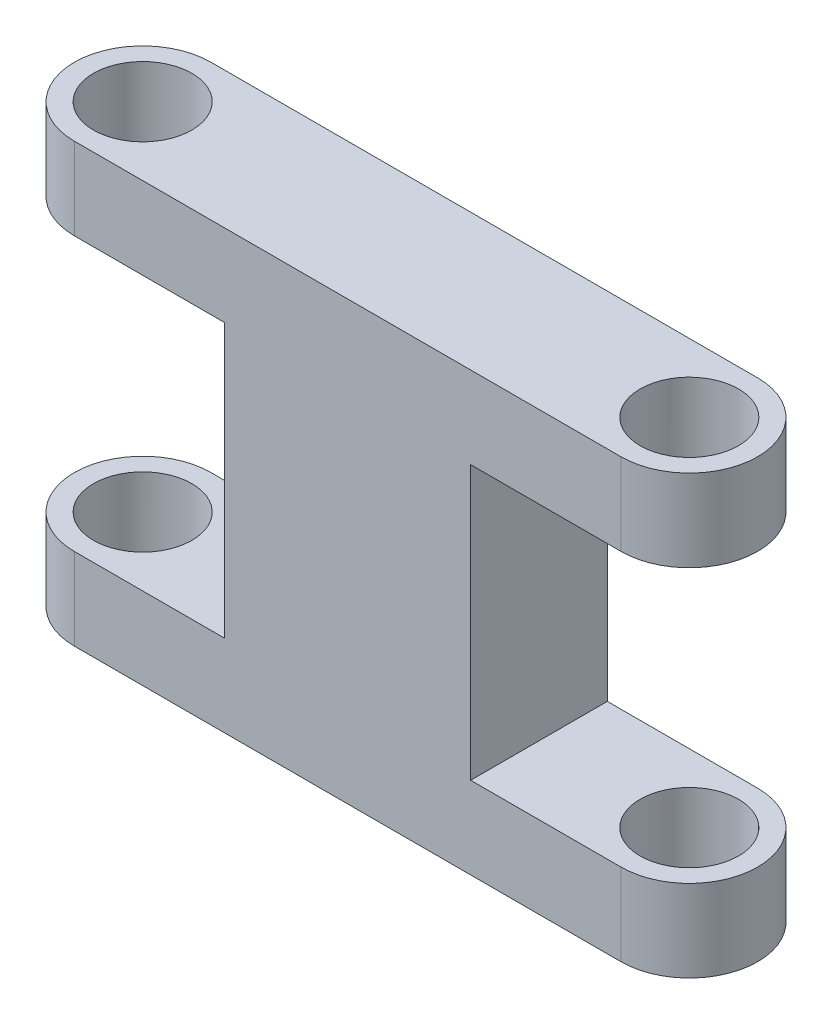
ISO-10303-21;
HEADER;
FILE_DESCRIPTION(('STEP AP214'),'2;1');
FILE_NAME('part.step','',(''),(''),'','','');
FILE_SCHEMA(('AUTOMOTIVE_DESIGN { 1 0 10303 214 1 1 1 1 }'));
ENDSEC;
DATA;
#1=APPLICATION_CONTEXT('core data for automotive mechanical design processes');
#2=APPLICATION_PROTOCOL_DEFINITION('international standard','automotive_design',2000,#1);
#3=PRODUCT_CONTEXT('',#1,'mechanical');
#4=PRODUCT('Part','Part','',(#3));
#5=PRODUCT_RELATED_PRODUCT_CATEGORY('part','',(#4));
#6=PRODUCT_DEFINITION_FORMATION('','',#4);
#7=PRODUCT_DEFINITION_CONTEXT('part definition',#1,'design');
#8=PRODUCT_DEFINITION('design','',#6,#7);
#9=PRODUCT_DEFINITION_SHAPE('','',#8);
#10=(LENGTH_UNIT() NAMED_UNIT(*) SI_UNIT(.MILLI.,.METRE.));
#11=(NAMED_UNIT(*) PLANE_ANGLE_UNIT() SI_UNIT($,.RADIAN.));
#12=(NAMED_UNIT(*) SI_UNIT($,.STERADIAN.) SOLID_ANGLE_UNIT());
#13=UNCERTAINTY_MEASURE_WITH_UNIT(LENGTH_MEASURE(1.E-05),#10,'distance_accuracy_value','');
#14=(GEOMETRIC_REPRESENTATION_CONTEXT(3) GLOBAL_UNCERTAINTY_ASSIGNED_CONTEXT((#13)) GLOBAL_UNIT_ASSIGNED_CONTEXT((#10,
#11,#12)) REPRESENTATION_CONTEXT('',''));
#15=CARTESIAN_POINT('',(0.,0.,0.));
#16=DIRECTION('',(0.,0.,1.));
#17=DIRECTION('',(1.,0.,0.));
#18=AXIS2_PLACEMENT_3D('',#15,#16,#17);
#19=CARTESIAN_POINT('',(24.,16.,4.));
#20=DIRECTION('',(0.,-1.,0.));
#21=DIRECTION('',(0.,0.,-1.));
#22=AXIS2_PLACEMENT_3D('',#19,#20,#21);
#23=CYLINDRICAL_SURFACE('',#22,2.5);
#24=CARTESIAN_POINT('',(24.,13.,4.));
#25=DIRECTION('',(0.,1.,0.));
#26=DIRECTION('',(-1.,0.,0.));
#27=AXIS2_PLACEMENT_3D('',#24,#25,#26);
#28=CIRCLE('',#27,2.5);
#29=CARTESIAN_POINT('',(24.,13.,6.5));
#30=VERTEX_POINT('',#29);
#31=CARTESIAN_POINT('',(24.,13.,1.5));
#32=VERTEX_POINT('',#31);
#33=EDGE_CURVE('E227',#30,#32,#28,.T.);
#34=ORIENTED_EDGE('',*,*,#33,.T.);
#35=DIRECTION('',(0.,-1.,0.));
#36=VECTOR('',#35,1.);
#37=CARTESIAN_POINT('',(24.,16.,1.5));
#38=LINE('',#37,#36);
#39=CARTESIAN_POINT('',(24.,16.,1.5));
#40=VERTEX_POINT('',#39);
#41=EDGE_CURVE('E161',#40,#32,#38,.T.);
#42=ORIENTED_EDGE('',*,*,#41,.F.);
#43=CARTESIAN_POINT('',(24.,16.,4.));
#44=DIRECTION('',(0.,1.,0.));
#45=DIRECTION('',(0.,0.,1.));
#46=AXIS2_PLACEMENT_3D('',#43,#44,#45);
#47=CIRCLE('',#46,2.5);
#48=CARTESIAN_POINT('',(24.,16.,6.5));
#49=VERTEX_POINT('',#48);
#50=EDGE_CURVE('E199',#40,#49,#47,.F.);
#51=ORIENTED_EDGE('',*,*,#50,.T.);
#52=DIRECTION('',(0.,-1.,0.));
#53=VECTOR('',#52,1.);
#54=CARTESIAN_POINT('',(24.,16.,6.5));
#55=LINE('',#54,#53);
#56=EDGE_CURVE('E11',#49,#30,#55,.T.);
#57=ORIENTED_EDGE('',*,*,#56,.T.);
#58=EDGE_LOOP('',(#34,#42,#51,#57));
#59=FACE_BOUND('',#58,.T.);
#60=ADVANCED_FACE('F37',(#59),#23,.T.);
#61=CARTESIAN_POINT('',(4.,16.,4.));
#62=DIRECTION('',(0.,-1.,0.));
#63=DIRECTION('',(0.,0.,-1.));
#64=AXIS2_PLACEMENT_3D('',#61,#62,#63);
#65=CYLINDRICAL_SURFACE('',#64,1.8);
#66=CARTESIAN_POINT('',(4.,13.,4.));
#67=DIRECTION('',(0.,1.,0.));
#68=DIRECTION('',(0.,0.,1.));
#69=AXIS2_PLACEMENT_3D('',#66,#67,#68);
#70=CIRCLE('',#69,1.8);
#71=CARTESIAN_POINT('',(4.,13.,5.8));
#72=VERTEX_POINT('',#71);
#73=EDGE_CURVE('E224',#72,#72,#70,.F.);
#74=ORIENTED_EDGE('',*,*,#73,.T.);
#75=EDGE_LOOP('',(#74));
#76=FACE_BOUND('',#75,.T.);
#77=CARTESIAN_POINT('',(4.,16.,4.));
#78=DIRECTION('',(0.,1.,0.));
#79=DIRECTION('',(0.,0.,1.));
#80=AXIS2_PLACEMENT_3D('',#77,#78,#79);
#81=CIRCLE('',#80,1.8);
#82=CARTESIAN_POINT('',(4.,16.,5.8));
#83=VERTEX_POINT('',#82);
#84=EDGE_CURVE('E213',#83,#83,#81,.T.);
#85=ORIENTED_EDGE('',*,*,#84,.T.);
#86=EDGE_LOOP('',(#85));
#87=FACE_BOUND('',#86,.T.);
#88=ADVANCED_FACE('F273',(#76,#87),#65,.F.);
#89=CARTESIAN_POINT('',(4.,16.,4.));
#90=DIRECTION('',(0.,-1.,0.));
#91=DIRECTION('',(0.,0.,-1.));
#92=AXIS2_PLACEMENT_3D('',#89,#90,#91);
#93=CYLINDRICAL_SURFACE('',#92,2.5);
#94=DIRECTION('',(0.,-1.,0.));
#95=VECTOR('',#94,1.);
#96=CARTESIAN_POINT('',(4.,16.,1.5));
#97=LINE('',#96,#95);
#98=CARTESIAN_POINT('',(4.,16.,1.5));
#99=VERTEX_POINT('',#98);
#100=CARTESIAN_POINT('',(4.,13.,1.5));
#101=VERTEX_POINT('',#100);
#102=EDGE_CURVE('E146',#99,#101,#97,.T.);
#103=ORIENTED_EDGE('',*,*,#102,.T.);
#104=CARTESIAN_POINT('',(4.,13.,4.));
#105=DIRECTION('',(0.,1.,0.));
#106=DIRECTION('',(0.,0.,1.));
#107=AXIS2_PLACEMENT_3D('',#104,#105,#106);
#108=CIRCLE('',#107,2.5);
#109=CARTESIAN_POINT('',(4.,13.,6.5));
#110=VERTEX_POINT('',#109);
#111=EDGE_CURVE('E129',#110,#101,#108,.F.);
#112=ORIENTED_EDGE('',*,*,#111,.F.);
#113=DIRECTION('',(0.,-1.,0.));
#114=VECTOR('',#113,1.);
#115=CARTESIAN_POINT('',(4.,16.,6.5));
#116=LINE('',#115,#114);
#117=CARTESIAN_POINT('',(4.,16.,6.5));
#118=VERTEX_POINT('',#117);
#119=EDGE_CURVE('E144',#118,#110,#116,.T.);
#120=ORIENTED_EDGE('',*,*,#119,.F.);
#121=CARTESIAN_POINT('',(4.,16.,4.));
#122=DIRECTION('',(0.,1.,0.));
#123=DIRECTION('',(0.,0.,1.));
#124=AXIS2_PLACEMENT_3D('',#121,#122,#123);
#125=CIRCLE('',#124,2.5);
#126=EDGE_CURVE('E211',#99,#118,#125,.T.);
#127=ORIENTED_EDGE('',*,*,#126,.F.);
#128=EDGE_LOOP('',(#103,#112,#120,#127));
#129=FACE_BOUND('',#128,.T.);
#130=ADVANCED_FACE('F142',(#129),#93,.T.);
#131=CARTESIAN_POINT('',(24.,16.,4.));
#132=DIRECTION('',(0.,-1.,0.));
#133=DIRECTION('',(0.,0.,-1.));
#134=AXIS2_PLACEMENT_3D('',#131,#132,#133);
#135=CYLINDRICAL_SURFACE('',#134,1.79999999999999);
#136=CARTESIAN_POINT('',(24.,13.,4.));
#137=DIRECTION('',(0.,1.,0.));
#138=DIRECTION('',(-1.,0.,0.));
#139=AXIS2_PLACEMENT_3D('',#136,#137,#138);
#140=CIRCLE('',#139,1.79999999999999);
#141=CARTESIAN_POINT('',(22.2,13.,4.));
#142=VERTEX_POINT('',#141);
#143=EDGE_CURVE('E234',#142,#142,#140,.T.);
#144=ORIENTED_EDGE('',*,*,#143,.F.);
#145=EDGE_LOOP('',(#144));
#146=FACE_BOUND('',#145,.T.);
#147=CARTESIAN_POINT('',(24.,16.,4.));
#148=DIRECTION('',(0.,1.,0.));
#149=DIRECTION('',(0.,0.,1.));
#150=AXIS2_PLACEMENT_3D('',#147,#148,#149);
#151=CIRCLE('',#150,1.79999999999999);
#152=CARTESIAN_POINT('',(24.,16.,5.79999999999999));
#153=VERTEX_POINT('',#152);
#154=EDGE_CURVE('E156',#153,#153,#151,.F.);
#155=ORIENTED_EDGE('',*,*,#154,.F.);
#156=EDGE_LOOP('',(#155));
#157=FACE_BOUND('',#156,.T.);
#158=ADVANCED_FACE('F259',(#146,#157),#135,.F.);
#159=CARTESIAN_POINT('',(0.,16.,6.5));
#160=DIRECTION('',(0.,0.,-1.));
#161=DIRECTION('',(-1.,0.,0.));
#162=AXIS2_PLACEMENT_3D('',#159,#160,#161);
#163=PLANE('',#162);
#164=ORIENTED_EDGE('',*,*,#119,.T.);
#165=DIRECTION('',(-1.,0.,0.));
#166=VECTOR('',#165,1.);
#167=CARTESIAN_POINT('',(1.5,13.,6.5));
#168=LINE('',#167,#166);
#169=CARTESIAN_POINT('',(9.5,13.,6.5));
#170=VERTEX_POINT('',#169);
#171=EDGE_CURVE('E125',#170,#110,#168,.T.);
#172=ORIENTED_EDGE('',*,*,#171,.F.);
#173=DIRECTION('',(0.,1.,0.));
#174=VECTOR('',#173,1.);
#175=CARTESIAN_POINT('',(9.5,13.,6.5));
#176=LINE('',#175,#174);
#177=CARTESIAN_POINT('',(9.5,3.,6.5));
#178=VERTEX_POINT('',#177);
#179=EDGE_CURVE('E137',#178,#170,#176,.T.);
#180=ORIENTED_EDGE('',*,*,#179,.F.);
#181=DIRECTION('',(1.,0.,0.));
#182=VECTOR('',#181,1.);
#183=CARTESIAN_POINT('',(1.5,3.,6.5));
#184=LINE('',#183,#182);
#185=CARTESIAN_POINT('',(4.,3.,6.5));
#186=VERTEX_POINT('',#185);
#187=EDGE_CURVE('E376',#186,#178,#184,.T.);
#188=ORIENTED_EDGE('',*,*,#187,.F.);
#189=CARTESIAN_POINT('',(4.,0.,6.5));
#190=VERTEX_POINT('',#189);
#191=EDGE_CURVE('E153',#186,#190,#116,.T.);
#192=ORIENTED_EDGE('',*,*,#191,.T.);
#193=DIRECTION('',(1.,0.,0.));
#194=VECTOR('',#193,1.);
#195=CARTESIAN_POINT('',(0.,0.,6.5));
#196=LINE('',#195,#194);
#197=CARTESIAN_POINT('',(24.,0.,6.5));
#198=VERTEX_POINT('',#197);
#199=EDGE_CURVE('E183',#190,#198,#196,.T.);
#200=ORIENTED_EDGE('',*,*,#199,.T.);
#201=CARTESIAN_POINT('',(24.,3.,6.5));
#202=VERTEX_POINT('',#201);
#203=EDGE_CURVE('E45',#202,#198,#55,.T.);
#204=ORIENTED_EDGE('',*,*,#203,.F.);
#205=DIRECTION('',(1.,0.,0.));
#206=VECTOR('',#205,1.);
#207=CARTESIAN_POINT('',(26.5,3.,6.5));
#208=LINE('',#207,#206);
#209=CARTESIAN_POINT('',(18.5,3.,6.5));
#210=VERTEX_POINT('',#209);
#211=EDGE_CURVE('E242',#210,#202,#208,.T.);
#212=ORIENTED_EDGE('',*,*,#211,.F.);
#213=DIRECTION('',(0.,-1.,0.));
#214=VECTOR('',#213,1.);
#215=CARTESIAN_POINT('',(18.5,13.,6.5));
#216=LINE('',#215,#214);
#217=CARTESIAN_POINT('',(18.5,13.,6.5));
#218=VERTEX_POINT('',#217);
#219=EDGE_CURVE('E239',#218,#210,#216,.T.);
#220=ORIENTED_EDGE('',*,*,#219,.F.);
#221=DIRECTION('',(-1.,0.,0.));
#222=VECTOR('',#221,1.);
#223=CARTESIAN_POINT('',(26.5,13.,6.5));
#224=LINE('',#223,#222);
#225=EDGE_CURVE('E233',#30,#218,#224,.T.);
#226=ORIENTED_EDGE('',*,*,#225,.F.);
#227=ORIENTED_EDGE('',*,*,#56,.F.);
#228=DIRECTION('',(1.,0.,0.));
#229=VECTOR('',#228,1.);
#230=CARTESIAN_POINT('',(0.,16.,6.5));
#231=LINE('',#230,#229);
#232=EDGE_CURVE('E151',#118,#49,#231,.T.);
#233=ORIENTED_EDGE('',*,*,#232,.F.);
#234=EDGE_LOOP('',(#164,#172,#180,#188,#192,#200,#204,#212,#220,#226,#227,#233));
#235=FACE_BOUND('',#234,.T.);
#236=ADVANCED_FACE('F39',(#235),#163,.F.);
#237=CARTESIAN_POINT('',(24.,3.,4.));
#238=DIRECTION('',(0.,-1.,0.));
#239=DIRECTION('',(1.,0.,0.));
#240=AXIS2_PLACEMENT_3D('',#237,#238,#239);
#241=CIRCLE('',#240,2.5);
#242=CARTESIAN_POINT('',(24.,3.,1.5));
#243=VERTEX_POINT('',#242);
#244=EDGE_CURVE('E225',#243,#202,#241,.T.);
#245=ORIENTED_EDGE('',*,*,#244,.T.);
#246=ORIENTED_EDGE('',*,*,#203,.T.);
#247=CARTESIAN_POINT('',(24.,0.,4.));
#248=DIRECTION('',(0.,1.,0.));
#249=DIRECTION('',(0.,0.,1.));
#250=AXIS2_PLACEMENT_3D('',#247,#248,#249);
#251=CIRCLE('',#250,2.5);
#252=CARTESIAN_POINT('',(24.,0.,1.5));
#253=VERTEX_POINT('',#252);
#254=EDGE_CURVE('E177',#253,#198,#251,.F.);
#255=ORIENTED_EDGE('',*,*,#254,.F.);
#256=EDGE_CURVE('E160',#243,#253,#38,.T.);
#257=ORIENTED_EDGE('',*,*,#256,.F.);
#258=EDGE_LOOP('',(#245,#246,#255,#257));
#259=FACE_BOUND('',#258,.T.);
#260=ADVANCED_FACE('F178',(#259),#23,.T.);
#261=CARTESIAN_POINT('',(0.,16.,1.5));
#262=DIRECTION('',(0.,0.,-1.));
#263=DIRECTION('',(-1.,0.,0.));
#264=AXIS2_PLACEMENT_3D('',#261,#262,#263);
#265=PLANE('',#264);
#266=DIRECTION('',(-1.,0.,0.));
#267=VECTOR('',#266,1.);
#268=CARTESIAN_POINT('',(1.5,13.,1.5));
#269=LINE('',#268,#267);
#270=CARTESIAN_POINT('',(9.5,13.,1.5));
#271=VERTEX_POINT('',#270);
#272=EDGE_CURVE('E379',#271,#101,#269,.T.);
#273=ORIENTED_EDGE('',*,*,#272,.T.);
#274=ORIENTED_EDGE('',*,*,#102,.F.);
#275=DIRECTION('',(1.,0.,0.));
#276=VECTOR('',#275,1.);
#277=CARTESIAN_POINT('',(0.,16.,1.5));
#278=LINE('',#277,#276);
#279=EDGE_CURVE('E204',#99,#40,#278,.T.);
#280=ORIENTED_EDGE('',*,*,#279,.T.);
#281=ORIENTED_EDGE('',*,*,#41,.T.);
#282=DIRECTION('',(-1.,0.,0.));
#283=VECTOR('',#282,1.);
#284=CARTESIAN_POINT('',(26.5,13.,1.5));
#285=LINE('',#284,#283);
#286=CARTESIAN_POINT('',(18.5,13.,1.5));
#287=VERTEX_POINT('',#286);
#288=EDGE_CURVE('E231',#32,#287,#285,.T.);
#289=ORIENTED_EDGE('',*,*,#288,.T.);
#290=DIRECTION('',(0.,-1.,0.));
#291=VECTOR('',#290,1.);
#292=CARTESIAN_POINT('',(18.5,13.,1.5));
#293=LINE('',#292,#291);
#294=CARTESIAN_POINT('',(18.5,3.,1.5));
#295=VERTEX_POINT('',#294);
#296=EDGE_CURVE('E247',#287,#295,#293,.T.);
#297=ORIENTED_EDGE('',*,*,#296,.T.);
#298=DIRECTION('',(1.,0.,0.));
#299=VECTOR('',#298,1.);
#300=CARTESIAN_POINT('',(26.5,3.,1.5));
#301=LINE('',#300,#299);
#302=EDGE_CURVE('E52',#295,#243,#301,.T.);
#303=ORIENTED_EDGE('',*,*,#302,.T.);
#304=ORIENTED_EDGE('',*,*,#256,.T.);
#305=DIRECTION('',(1.,0.,0.));
#306=VECTOR('',#305,1.);
#307=CARTESIAN_POINT('',(0.,0.,1.5));
#308=LINE('',#307,#306);
#309=CARTESIAN_POINT('',(4.,0.,1.5));
#310=VERTEX_POINT('',#309);
#311=EDGE_CURVE('E172',#310,#253,#308,.T.);
#312=ORIENTED_EDGE('',*,*,#311,.F.);
#313=CARTESIAN_POINT('',(4.,3.,1.5));
#314=VERTEX_POINT('',#313);
#315=EDGE_CURVE('E152',#314,#310,#97,.T.);
#316=ORIENTED_EDGE('',*,*,#315,.F.);
#317=DIRECTION('',(1.,0.,0.));
#318=VECTOR('',#317,1.);
#319=CARTESIAN_POINT('',(1.5,3.,1.5));
#320=LINE('',#319,#318);
#321=CARTESIAN_POINT('',(9.5,3.,1.5));
#322=VERTEX_POINT('',#321);
#323=EDGE_CURVE('E60',#314,#322,#320,.T.);
#324=ORIENTED_EDGE('',*,*,#323,.T.);
#325=DIRECTION('',(0.,1.,0.));
#326=VECTOR('',#325,1.);
#327=CARTESIAN_POINT('',(9.5,13.,1.5));
#328=LINE('',#327,#326);
#329=EDGE_CURVE('E382',#322,#271,#328,.T.);
#330=ORIENTED_EDGE('',*,*,#329,.T.);
#331=EDGE_LOOP('',(#273,#274,#280,#281,#289,#297,#303,#304,#312,#316,#324,#330));
#332=FACE_BOUND('',#331,.T.);
#333=ADVANCED_FACE('F169',(#332),#265,.T.);
#334=CARTESIAN_POINT('',(4.,3.,4.));
#335=DIRECTION('',(0.,-1.,0.));
#336=DIRECTION('',(0.,0.,-1.));
#337=AXIS2_PLACEMENT_3D('',#334,#335,#336);
#338=CIRCLE('',#337,1.8);
#339=CARTESIAN_POINT('',(4.,3.,2.2));
#340=VERTEX_POINT('',#339);
#341=EDGE_CURVE('E147',#340,#340,#338,.F.);
#342=ORIENTED_EDGE('',*,*,#341,.T.);
#343=EDGE_LOOP('',(#342));
#344=FACE_BOUND('',#343,.T.);
#345=CARTESIAN_POINT('',(4.,0.,4.));
#346=DIRECTION('',(0.,1.,0.));
#347=DIRECTION('',(0.,0.,1.));
#348=AXIS2_PLACEMENT_3D('',#345,#346,#347);
#349=CIRCLE('',#348,1.8);
#350=CARTESIAN_POINT('',(4.,0.,5.8));
#351=VERTEX_POINT('',#350);
#352=EDGE_CURVE('E191',#351,#351,#349,.T.);
#353=ORIENTED_EDGE('',*,*,#352,.F.);
#354=EDGE_LOOP('',(#353));
#355=FACE_BOUND('',#354,.T.);
#356=ADVANCED_FACE('F265',(#344,#355),#65,.F.);
#357=ORIENTED_EDGE('',*,*,#191,.F.);
#358=CARTESIAN_POINT('',(4.,3.,4.));
#359=DIRECTION('',(0.,-1.,0.));
#360=DIRECTION('',(0.,0.,-1.));
#361=AXIS2_PLACEMENT_3D('',#358,#359,#360);
#362=CIRCLE('',#361,2.5);
#363=EDGE_CURVE('E148',#314,#186,#362,.F.);
#364=ORIENTED_EDGE('',*,*,#363,.F.);
#365=ORIENTED_EDGE('',*,*,#315,.T.);
#366=CARTESIAN_POINT('',(4.,0.,4.));
#367=DIRECTION('',(0.,1.,0.));
#368=DIRECTION('',(0.,0.,1.));
#369=AXIS2_PLACEMENT_3D('',#366,#367,#368);
#370=CIRCLE('',#369,2.5);
#371=EDGE_CURVE('E189',#310,#190,#370,.T.);
#372=ORIENTED_EDGE('',*,*,#371,.T.);
#373=EDGE_LOOP('',(#357,#364,#365,#372));
#374=FACE_BOUND('',#373,.T.);
#375=ADVANCED_FACE('F257',(#374),#93,.T.);
#376=CARTESIAN_POINT('',(24.,3.,4.));
#377=DIRECTION('',(0.,-1.,0.));
#378=DIRECTION('',(1.,0.,0.));
#379=AXIS2_PLACEMENT_3D('',#376,#377,#378);
#380=CIRCLE('',#379,1.79999999999999);
#381=CARTESIAN_POINT('',(25.8,3.,4.));
#382=VERTEX_POINT('',#381);
#383=EDGE_CURVE('E207',#382,#382,#380,.T.);
#384=ORIENTED_EDGE('',*,*,#383,.F.);
#385=EDGE_LOOP('',(#384));
#386=FACE_BOUND('',#385,.T.);
#387=CARTESIAN_POINT('',(24.,0.,4.));
#388=DIRECTION('',(0.,1.,0.));
#389=DIRECTION('',(0.,0.,1.));
#390=AXIS2_PLACEMENT_3D('',#387,#388,#389);
#391=CIRCLE('',#390,1.79999999999999);
#392=CARTESIAN_POINT('',(24.,0.,5.79999999999999));
#393=VERTEX_POINT('',#392);
#394=EDGE_CURVE('E158',#393,#393,#391,.F.);
#395=ORIENTED_EDGE('',*,*,#394,.T.);
#396=EDGE_LOOP('',(#395));
#397=FACE_BOUND('',#396,.T.);
#398=ADVANCED_FACE('F254',(#386,#397),#135,.F.);
#399=CARTESIAN_POINT('',(0.,16.,0.));
#400=DIRECTION('',(0.,1.,0.));
#401=DIRECTION('',(0.,0.,1.));
#402=AXIS2_PLACEMENT_3D('',#399,#400,#401);
#403=PLANE('',#402);
#404=ORIENTED_EDGE('',*,*,#232,.T.);
#405=ORIENTED_EDGE('',*,*,#50,.F.);
#406=ORIENTED_EDGE('',*,*,#279,.F.);
#407=ORIENTED_EDGE('',*,*,#126,.T.);
#408=EDGE_LOOP('',(#404,#405,#406,#407));
#409=FACE_BOUND('',#408,.T.);
#410=ORIENTED_EDGE('',*,*,#84,.F.);
#411=EDGE_LOOP('',(#410));
#412=FACE_BOUND('',#411,.T.);
#413=ORIENTED_EDGE('',*,*,#154,.T.);
#414=EDGE_LOOP('',(#413));
#415=FACE_BOUND('',#414,.T.);
#416=ADVANCED_FACE('F256',(#409,#412,#415),#403,.T.);
#417=CARTESIAN_POINT('',(0.,0.,0.));
#418=DIRECTION('',(0.,1.,0.));
#419=DIRECTION('',(0.,0.,1.));
#420=AXIS2_PLACEMENT_3D('',#417,#418,#419);
#421=PLANE('',#420);
#422=ORIENTED_EDGE('',*,*,#199,.F.);
#423=ORIENTED_EDGE('',*,*,#371,.F.);
#424=ORIENTED_EDGE('',*,*,#311,.T.);
#425=ORIENTED_EDGE('',*,*,#254,.T.);
#426=EDGE_LOOP('',(#422,#423,#424,#425));
#427=FACE_BOUND('',#426,.T.);
#428=ORIENTED_EDGE('',*,*,#352,.T.);
#429=EDGE_LOOP('',(#428));
#430=FACE_BOUND('',#429,.T.);
#431=ORIENTED_EDGE('',*,*,#394,.F.);
#432=EDGE_LOOP('',(#431));
#433=FACE_BOUND('',#432,.T.);
#434=ADVANCED_FACE('F186',(#427,#430,#433),#421,.F.);
#435=CARTESIAN_POINT('',(26.5,13.,1.499));
#436=DIRECTION('',(0.,1.,0.));
#437=DIRECTION('',(-1.,0.,0.));
#438=AXIS2_PLACEMENT_3D('',#435,#436,#437);
#439=PLANE('',#438);
#440=ORIENTED_EDGE('',*,*,#143,.T.);
#441=EDGE_LOOP('',(#440));
#442=FACE_BOUND('',#441,.T.);
#443=ORIENTED_EDGE('',*,*,#225,.T.);
#444=DIRECTION('',(0.,0.,1.));
#445=VECTOR('',#444,1.);
#446=CARTESIAN_POINT('',(18.5,13.,1.499));
#447=LINE('',#446,#445);
#448=EDGE_CURVE('E244',#287,#218,#447,.T.);
#449=ORIENTED_EDGE('',*,*,#448,.F.);
#450=ORIENTED_EDGE('',*,*,#288,.F.);
#451=ORIENTED_EDGE('',*,*,#33,.F.);
#452=EDGE_LOOP('',(#443,#449,#450,#451));
#453=FACE_BOUND('',#452,.T.);
#454=ADVANCED_FACE('F314',(#442,#453),#439,.F.);
#455=CARTESIAN_POINT('',(26.5,3.,1.499));
#456=DIRECTION('',(0.,-1.,0.));
#457=DIRECTION('',(1.,0.,0.));
#458=AXIS2_PLACEMENT_3D('',#455,#456,#457);
#459=PLANE('',#458);
#460=ORIENTED_EDGE('',*,*,#383,.T.);
#461=EDGE_LOOP('',(#460));
#462=FACE_BOUND('',#461,.T.);
#463=ORIENTED_EDGE('',*,*,#244,.F.);
#464=ORIENTED_EDGE('',*,*,#302,.F.);
#465=DIRECTION('',(0.,0.,1.));
#466=VECTOR('',#465,1.);
#467=CARTESIAN_POINT('',(18.5,3.,1.499));
#468=LINE('',#467,#466);
#469=EDGE_CURVE('E245',#295,#210,#468,.T.);
#470=ORIENTED_EDGE('',*,*,#469,.T.);
#471=ORIENTED_EDGE('',*,*,#211,.T.);
#472=EDGE_LOOP('',(#463,#464,#470,#471));
#473=FACE_BOUND('',#472,.T.);
#474=ADVANCED_FACE('F252',(#462,#473),#459,.F.);
#475=CARTESIAN_POINT('',(18.5,13.,1.499));
#476=DIRECTION('',(-1.,0.,0.));
#477=DIRECTION('',(0.,0.,1.));
#478=AXIS2_PLACEMENT_3D('',#475,#476,#477);
#479=PLANE('',#478);
#480=ORIENTED_EDGE('',*,*,#448,.T.);
#481=ORIENTED_EDGE('',*,*,#219,.T.);
#482=ORIENTED_EDGE('',*,*,#469,.F.);
#483=ORIENTED_EDGE('',*,*,#296,.F.);
#484=EDGE_LOOP('',(#480,#481,#482,#483));
#485=FACE_BOUND('',#484,.T.);
#486=ADVANCED_FACE('F391',(#485),#479,.F.);
#487=CARTESIAN_POINT('',(1.5,13.,1.499));
#488=DIRECTION('',(0.,1.,0.));
#489=DIRECTION('',(0.,0.,1.));
#490=AXIS2_PLACEMENT_3D('',#487,#488,#489);
#491=PLANE('',#490);
#492=ORIENTED_EDGE('',*,*,#73,.F.);
#493=EDGE_LOOP('',(#492));
#494=FACE_BOUND('',#493,.T.);
#495=DIRECTION('',(0.,0.,1.));
#496=VECTOR('',#495,1.);
#497=CARTESIAN_POINT('',(9.5,13.,1.499));
#498=LINE('',#497,#496);
#499=EDGE_CURVE('E131',#271,#170,#498,.T.);
#500=ORIENTED_EDGE('',*,*,#499,.T.);
#501=ORIENTED_EDGE('',*,*,#171,.T.);
#502=ORIENTED_EDGE('',*,*,#111,.T.);
#503=ORIENTED_EDGE('',*,*,#272,.F.);
#504=EDGE_LOOP('',(#500,#501,#502,#503));
#505=FACE_BOUND('',#504,.T.);
#506=ADVANCED_FACE('F127',(#494,#505),#491,.F.);
#507=CARTESIAN_POINT('',(1.5,3.,1.499));
#508=DIRECTION('',(0.,-1.,0.));
#509=DIRECTION('',(0.,0.,-1.));
#510=AXIS2_PLACEMENT_3D('',#507,#508,#509);
#511=PLANE('',#510);
#512=ORIENTED_EDGE('',*,*,#341,.F.);
#513=EDGE_LOOP('',(#512));
#514=FACE_BOUND('',#513,.T.);
#515=ORIENTED_EDGE('',*,*,#363,.T.);
#516=ORIENTED_EDGE('',*,*,#187,.T.);
#517=DIRECTION('',(0.,0.,1.));
#518=VECTOR('',#517,1.);
#519=CARTESIAN_POINT('',(9.5,3.,1.499));
#520=LINE('',#519,#518);
#521=EDGE_CURVE('E136',#322,#178,#520,.T.);
#522=ORIENTED_EDGE('',*,*,#521,.F.);
#523=ORIENTED_EDGE('',*,*,#323,.F.);
#524=EDGE_LOOP('',(#515,#516,#522,#523));
#525=FACE_BOUND('',#524,.T.);
#526=ADVANCED_FACE('F370',(#514,#525),#511,.F.);
#527=CARTESIAN_POINT('',(9.5,13.,1.499));
#528=DIRECTION('',(1.,0.,0.));
#529=DIRECTION('',(0.,0.,-1.));
#530=AXIS2_PLACEMENT_3D('',#527,#528,#529);
#531=PLANE('',#530);
#532=ORIENTED_EDGE('',*,*,#521,.T.);
#533=ORIENTED_EDGE('',*,*,#179,.T.);
#534=ORIENTED_EDGE('',*,*,#499,.F.);
#535=ORIENTED_EDGE('',*,*,#329,.F.);
#536=EDGE_LOOP('',(#532,#533,#534,#535));
#537=FACE_BOUND('',#536,.T.);
#538=ADVANCED_FACE('F372',(#537),#531,.F.);
#539=CLOSED_SHELL('',(#60,#88,#130,#158,#236,#260,#333,#356,#375,#398,#416,#434,#454,#474,#486,
#506,#526,#538));
#540=MANIFOLD_SOLID_BREP('B2',#539);
#541=ADVANCED_BREP_SHAPE_REPRESENTATION('',(#18,#540),#14);
#542=SHAPE_DEFINITION_REPRESENTATION(#9,#541);
ENDSEC;
END-ISO-10303-21;
